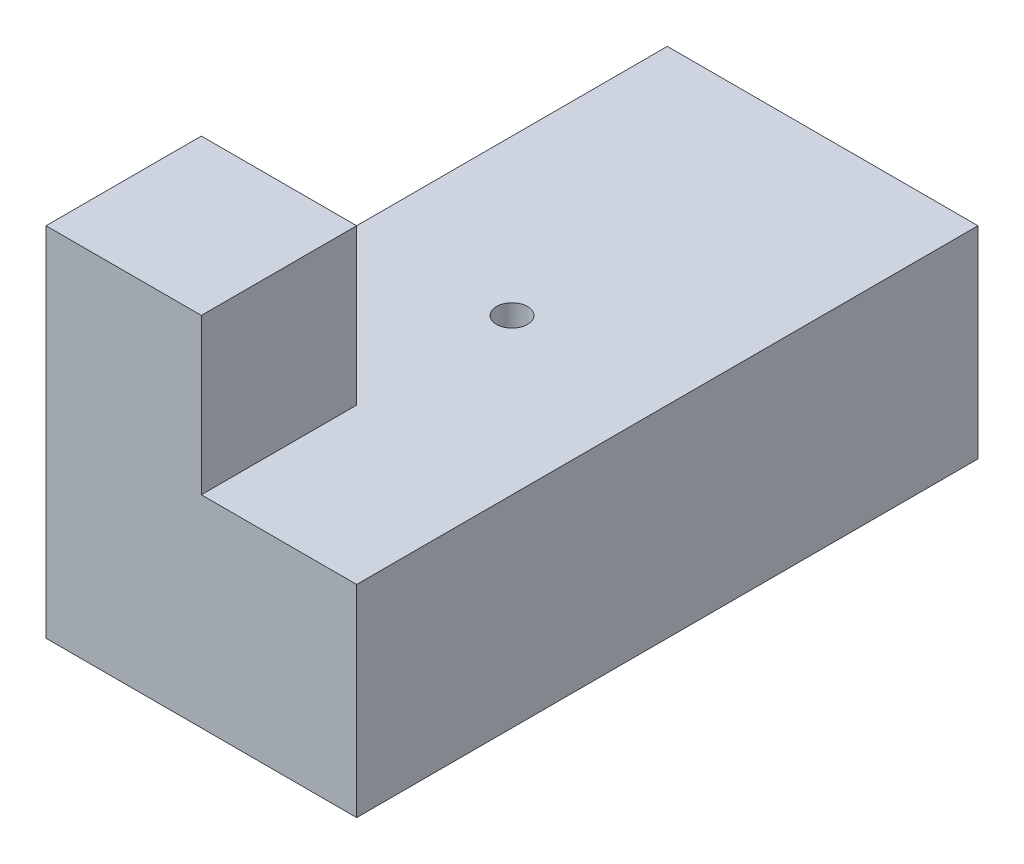
ISO-10303-21;
HEADER;
FILE_DESCRIPTION(('STEP AP214'),'2;1');
FILE_NAME('part.step','',(''),(''),'','','');
FILE_SCHEMA(('AUTOMOTIVE_DESIGN { 1 0 10303 214 1 1 1 1 }'));
ENDSEC;
DATA;
#1=APPLICATION_CONTEXT('core data for automotive mechanical design processes');
#2=APPLICATION_PROTOCOL_DEFINITION('international standard','automotive_design',2000,#1);
#3=PRODUCT_CONTEXT('',#1,'mechanical');
#4=PRODUCT('Part','Part','',(#3));
#5=PRODUCT_RELATED_PRODUCT_CATEGORY('part','',(#4));
#6=PRODUCT_DEFINITION_FORMATION('','',#4);
#7=PRODUCT_DEFINITION_CONTEXT('part definition',#1,'design');
#8=PRODUCT_DEFINITION('design','',#6,#7);
#9=PRODUCT_DEFINITION_SHAPE('','',#8);
#10=(LENGTH_UNIT() NAMED_UNIT(*) SI_UNIT(.MILLI.,.METRE.));
#11=(NAMED_UNIT(*) PLANE_ANGLE_UNIT() SI_UNIT($,.RADIAN.));
#12=(NAMED_UNIT(*) SI_UNIT($,.STERADIAN.) SOLID_ANGLE_UNIT());
#13=UNCERTAINTY_MEASURE_WITH_UNIT(LENGTH_MEASURE(1.E-05),#10,'distance_accuracy_value','');
#14=(GEOMETRIC_REPRESENTATION_CONTEXT(3) GLOBAL_UNCERTAINTY_ASSIGNED_CONTEXT((#13)) GLOBAL_UNIT_ASSIGNED_CONTEXT((#10,
#11,#12)) REPRESENTATION_CONTEXT('',''));
#15=CARTESIAN_POINT('',(0.,0.,0.));
#16=DIRECTION('',(0.,0.,1.));
#17=DIRECTION('',(1.,0.,0.));
#18=AXIS2_PLACEMENT_3D('',#15,#16,#17);
#19=CARTESIAN_POINT('',(100.,65.,0.));
#20=DIRECTION('',(1.,0.,0.));
#21=DIRECTION('',(0.,0.,-1.));
#22=AXIS2_PLACEMENT_3D('',#19,#20,#21);
#23=PLANE('',#22);
#24=DIRECTION('',(0.,0.,1.));
#25=VECTOR('',#24,1.);
#26=CARTESIAN_POINT('',(100.,0.,0.));
#27=LINE('',#26,#25);
#28=CARTESIAN_POINT('',(100.,0.,-200.));
#29=VERTEX_POINT('',#28);
#30=CARTESIAN_POINT('',(100.,0.,0.));
#31=VERTEX_POINT('',#30);
#32=EDGE_CURVE('E140',#29,#31,#27,.T.);
#33=ORIENTED_EDGE('',*,*,#32,.F.);
#34=DIRECTION('',(0.,-1.,0.));
#35=VECTOR('',#34,1.);
#36=CARTESIAN_POINT('',(100.,65.,-200.));
#37=LINE('',#36,#35);
#38=CARTESIAN_POINT('',(100.,65.,-200.));
#39=VERTEX_POINT('',#38);
#40=EDGE_CURVE('E11',#39,#29,#37,.T.);
#41=ORIENTED_EDGE('',*,*,#40,.F.);
#42=DIRECTION('',(0.,0.,1.));
#43=VECTOR('',#42,1.);
#44=CARTESIAN_POINT('',(100.,65.,0.));
#45=LINE('',#44,#43);
#46=CARTESIAN_POINT('',(100.,65.,0.));
#47=VERTEX_POINT('',#46);
#48=EDGE_CURVE('E141',#39,#47,#45,.T.);
#49=ORIENTED_EDGE('',*,*,#48,.T.);
#50=DIRECTION('',(0.,-1.,0.));
#51=VECTOR('',#50,1.);
#52=CARTESIAN_POINT('',(100.,65.,0.));
#53=LINE('',#52,#51);
#54=EDGE_CURVE('E106',#47,#31,#53,.T.);
#55=ORIENTED_EDGE('',*,*,#54,.T.);
#56=EDGE_LOOP('',(#33,#41,#49,#55));
#57=FACE_BOUND('',#56,.T.);
#58=ADVANCED_FACE('F35',(#57),#23,.T.);
#59=CARTESIAN_POINT('',(0.,65.,-200.));
#60=DIRECTION('',(0.,0.,-1.));
#61=DIRECTION('',(-1.,0.,0.));
#62=AXIS2_PLACEMENT_3D('',#59,#60,#61);
#63=PLANE('',#62);
#64=DIRECTION('',(1.,0.,0.));
#65=VECTOR('',#64,1.);
#66=CARTESIAN_POINT('',(0.,0.,-200.));
#67=LINE('',#66,#65);
#68=CARTESIAN_POINT('',(0.,0.,-200.));
#69=VERTEX_POINT('',#68);
#70=EDGE_CURVE('E153',#69,#29,#67,.T.);
#71=ORIENTED_EDGE('',*,*,#70,.F.);
#72=DIRECTION('',(0.,-1.,0.));
#73=VECTOR('',#72,1.);
#74=CARTESIAN_POINT('',(0.,65.,-200.));
#75=LINE('',#74,#73);
#76=CARTESIAN_POINT('',(0.,65.,-200.));
#77=VERTEX_POINT('',#76);
#78=EDGE_CURVE('E42',#77,#69,#75,.T.);
#79=ORIENTED_EDGE('',*,*,#78,.F.);
#80=DIRECTION('',(1.,0.,0.));
#81=VECTOR('',#80,1.);
#82=CARTESIAN_POINT('',(0.,65.,-200.));
#83=LINE('',#82,#81);
#84=EDGE_CURVE('E144',#77,#39,#83,.T.);
#85=ORIENTED_EDGE('',*,*,#84,.T.);
#86=ORIENTED_EDGE('',*,*,#40,.T.);
#87=EDGE_LOOP('',(#71,#79,#85,#86));
#88=FACE_BOUND('',#87,.T.);
#89=ADVANCED_FACE('F162',(#88),#63,.T.);
#90=CARTESIAN_POINT('',(0.,65.,0.));
#91=DIRECTION('',(1.,0.,0.));
#92=DIRECTION('',(0.,0.,-1.));
#93=AXIS2_PLACEMENT_3D('',#90,#91,#92);
#94=PLANE('',#93);
#95=DIRECTION('',(0.,0.,1.));
#96=VECTOR('',#95,1.);
#97=CARTESIAN_POINT('',(0.,0.,0.));
#98=LINE('',#97,#96);
#99=CARTESIAN_POINT('',(0.,0.,0.));
#100=VERTEX_POINT('',#99);
#101=EDGE_CURVE('E102',#69,#100,#98,.T.);
#102=ORIENTED_EDGE('',*,*,#101,.T.);
#103=DIRECTION('',(0.,-1.,0.));
#104=VECTOR('',#103,1.);
#105=CARTESIAN_POINT('',(0.,65.,0.));
#106=LINE('',#105,#104);
#107=CARTESIAN_POINT('',(0.,115.,0.));
#108=VERTEX_POINT('',#107);
#109=EDGE_CURVE('E95',#108,#100,#106,.T.);
#110=ORIENTED_EDGE('',*,*,#109,.F.);
#111=DIRECTION('',(0.,0.,1.));
#112=VECTOR('',#111,1.);
#113=CARTESIAN_POINT('',(0.,115.,0.));
#114=LINE('',#113,#112);
#115=CARTESIAN_POINT('',(0.,115.,-50.));
#116=VERTEX_POINT('',#115);
#117=EDGE_CURVE('E100',#116,#108,#114,.T.);
#118=ORIENTED_EDGE('',*,*,#117,.F.);
#119=DIRECTION('',(0.,-1.,0.));
#120=VECTOR('',#119,1.);
#121=CARTESIAN_POINT('',(0.,115.,-50.));
#122=LINE('',#121,#120);
#123=CARTESIAN_POINT('',(0.,65.,-50.));
#124=VERTEX_POINT('',#123);
#125=EDGE_CURVE('E127',#116,#124,#122,.T.);
#126=ORIENTED_EDGE('',*,*,#125,.T.);
#127=DIRECTION('',(0.,0.,1.));
#128=VECTOR('',#127,1.);
#129=CARTESIAN_POINT('',(0.,65.,0.));
#130=LINE('',#129,#128);
#131=EDGE_CURVE('E55',#77,#124,#130,.T.);
#132=ORIENTED_EDGE('',*,*,#131,.F.);
#133=ORIENTED_EDGE('',*,*,#78,.T.);
#134=EDGE_LOOP('',(#102,#110,#118,#126,#132,#133));
#135=FACE_BOUND('',#134,.T.);
#136=ADVANCED_FACE('F97',(#135),#94,.F.);
#137=CARTESIAN_POINT('',(0.,65.,0.));
#138=DIRECTION('',(0.,0.,-1.));
#139=DIRECTION('',(-1.,0.,0.));
#140=AXIS2_PLACEMENT_3D('',#137,#138,#139);
#141=PLANE('',#140);
#142=DIRECTION('',(1.,0.,0.));
#143=VECTOR('',#142,1.);
#144=CARTESIAN_POINT('',(0.,0.,0.));
#145=LINE('',#144,#143);
#146=EDGE_CURVE('E145',#100,#31,#145,.T.);
#147=ORIENTED_EDGE('',*,*,#146,.T.);
#148=ORIENTED_EDGE('',*,*,#54,.F.);
#149=DIRECTION('',(1.,0.,0.));
#150=VECTOR('',#149,1.);
#151=CARTESIAN_POINT('',(0.,65.,0.));
#152=LINE('',#151,#150);
#153=CARTESIAN_POINT('',(50.,65.,0.));
#154=VERTEX_POINT('',#153);
#155=EDGE_CURVE('E149',#154,#47,#152,.T.);
#156=ORIENTED_EDGE('',*,*,#155,.F.);
#157=DIRECTION('',(0.,-1.,0.));
#158=VECTOR('',#157,1.);
#159=CARTESIAN_POINT('',(50.,115.,0.));
#160=LINE('',#159,#158);
#161=CARTESIAN_POINT('',(50.,115.,0.));
#162=VERTEX_POINT('',#161);
#163=EDGE_CURVE('E112',#162,#154,#160,.T.);
#164=ORIENTED_EDGE('',*,*,#163,.F.);
#165=DIRECTION('',(1.,0.,0.));
#166=VECTOR('',#165,1.);
#167=CARTESIAN_POINT('',(0.,115.,0.));
#168=LINE('',#167,#166);
#169=EDGE_CURVE('E109',#108,#162,#168,.T.);
#170=ORIENTED_EDGE('',*,*,#169,.F.);
#171=ORIENTED_EDGE('',*,*,#109,.T.);
#172=EDGE_LOOP('',(#147,#148,#156,#164,#170,#171));
#173=FACE_BOUND('',#172,.T.);
#174=ADVANCED_FACE('F110',(#173),#141,.F.);
#175=CARTESIAN_POINT('',(0.,65.,0.));
#176=DIRECTION('',(0.,1.,0.));
#177=DIRECTION('',(0.,0.,1.));
#178=AXIS2_PLACEMENT_3D('',#175,#176,#177);
#179=PLANE('',#178);
#180=DIRECTION('',(-1.,0.,0.));
#181=VECTOR('',#180,1.);
#182=CARTESIAN_POINT('',(0.,65.,-50.));
#183=LINE('',#182,#181);
#184=CARTESIAN_POINT('',(50.,65.,-50.));
#185=VERTEX_POINT('',#184);
#186=EDGE_CURVE('E121',#185,#124,#183,.T.);
#187=ORIENTED_EDGE('',*,*,#186,.F.);
#188=DIRECTION('',(0.,0.,-1.));
#189=VECTOR('',#188,1.);
#190=CARTESIAN_POINT('',(50.,65.,0.));
#191=LINE('',#190,#189);
#192=EDGE_CURVE('E49',#154,#185,#191,.T.);
#193=ORIENTED_EDGE('',*,*,#192,.F.);
#194=ORIENTED_EDGE('',*,*,#155,.T.);
#195=ORIENTED_EDGE('',*,*,#48,.F.);
#196=ORIENTED_EDGE('',*,*,#84,.F.);
#197=ORIENTED_EDGE('',*,*,#131,.T.);
#198=EDGE_LOOP('',(#187,#193,#194,#195,#196,#197));
#199=FACE_BOUND('',#198,.T.);
#200=CARTESIAN_POINT('',(50.,65.,-100.));
#201=DIRECTION('',(0.,1.,0.));
#202=DIRECTION('',(0.,0.,1.));
#203=AXIS2_PLACEMENT_3D('',#200,#201,#202);
#204=CIRCLE('',#203,5.);
#205=CARTESIAN_POINT('',(50.,65.,-95.));
#206=VERTEX_POINT('',#205);
#207=EDGE_CURVE('E134',#206,#206,#204,.T.);
#208=ORIENTED_EDGE('',*,*,#207,.F.);
#209=EDGE_LOOP('',(#208));
#210=FACE_BOUND('',#209,.T.);
#211=ADVANCED_FACE('F172',(#199,#210),#179,.T.);
#212=CARTESIAN_POINT('',(0.,0.,0.));
#213=DIRECTION('',(0.,1.,0.));
#214=DIRECTION('',(0.,0.,1.));
#215=AXIS2_PLACEMENT_3D('',#212,#213,#214);
#216=PLANE('',#215);
#217=ORIENTED_EDGE('',*,*,#32,.T.);
#218=ORIENTED_EDGE('',*,*,#146,.F.);
#219=ORIENTED_EDGE('',*,*,#101,.F.);
#220=ORIENTED_EDGE('',*,*,#70,.T.);
#221=EDGE_LOOP('',(#217,#218,#219,#220));
#222=FACE_BOUND('',#221,.T.);
#223=ADVANCED_FACE('F161',(#222),#216,.F.);
#224=CARTESIAN_POINT('',(50.,25.,-100.));
#225=DIRECTION('',(0.,1.,0.));
#226=DIRECTION('',(0.,0.,1.));
#227=AXIS2_PLACEMENT_3D('',#224,#225,#226);
#228=CONICAL_SURFACE('',#227,4.99999999999999,1.02974425867665);
#229=CARTESIAN_POINT('',(50.,21.9956969048622,-100.));
#230=VERTEX_POINT('',#229);
#231=VERTEX_LOOP('',#230);
#232=FACE_BOUND('',#231,.T.);
#233=CARTESIAN_POINT('',(50.,25.,-100.));
#234=DIRECTION('',(0.,1.,0.));
#235=DIRECTION('',(0.,0.,1.));
#236=AXIS2_PLACEMENT_3D('',#233,#234,#235);
#237=CIRCLE('',#236,4.99999999999999);
#238=CARTESIAN_POINT('',(50.,25.,-95.));
#239=VERTEX_POINT('',#238);
#240=EDGE_CURVE('E137',#239,#239,#237,.T.);
#241=ORIENTED_EDGE('',*,*,#240,.T.);
#242=EDGE_LOOP('',(#241));
#243=FACE_BOUND('',#242,.T.);
#244=ADVANCED_FACE('F180',(#232,#243),#228,.F.);
#245=CARTESIAN_POINT('',(50.,65.,-100.));
#246=DIRECTION('',(0.,1.,0.));
#247=DIRECTION('',(0.,0.,1.));
#248=AXIS2_PLACEMENT_3D('',#245,#246,#247);
#249=CYLINDRICAL_SURFACE('',#248,4.99999999999999);
#250=ORIENTED_EDGE('',*,*,#240,.F.);
#251=EDGE_LOOP('',(#250));
#252=FACE_BOUND('',#251,.T.);
#253=ORIENTED_EDGE('',*,*,#207,.T.);
#254=EDGE_LOOP('',(#253));
#255=FACE_BOUND('',#254,.T.);
#256=ADVANCED_FACE('F178',(#252,#255),#249,.F.);
#257=CARTESIAN_POINT('',(50.,115.,0.));
#258=DIRECTION('',(-1.,0.,0.));
#259=DIRECTION('',(0.,0.,1.));
#260=AXIS2_PLACEMENT_3D('',#257,#258,#259);
#261=PLANE('',#260);
#262=ORIENTED_EDGE('',*,*,#192,.T.);
#263=DIRECTION('',(0.,-1.,0.));
#264=VECTOR('',#263,1.);
#265=CARTESIAN_POINT('',(50.,115.,-50.));
#266=LINE('',#265,#264);
#267=CARTESIAN_POINT('',(50.,115.,-50.));
#268=VERTEX_POINT('',#267);
#269=EDGE_CURVE('E130',#268,#185,#266,.T.);
#270=ORIENTED_EDGE('',*,*,#269,.F.);
#271=DIRECTION('',(0.,0.,-1.));
#272=VECTOR('',#271,1.);
#273=CARTESIAN_POINT('',(50.,115.,0.));
#274=LINE('',#273,#272);
#275=EDGE_CURVE('E115',#162,#268,#274,.T.);
#276=ORIENTED_EDGE('',*,*,#275,.F.);
#277=ORIENTED_EDGE('',*,*,#163,.T.);
#278=EDGE_LOOP('',(#262,#270,#276,#277));
#279=FACE_BOUND('',#278,.T.);
#280=ADVANCED_FACE('F168',(#279),#261,.F.);
#281=CARTESIAN_POINT('',(0.,115.,-50.));
#282=DIRECTION('',(0.,0.,1.));
#283=DIRECTION('',(1.,0.,0.));
#284=AXIS2_PLACEMENT_3D('',#281,#282,#283);
#285=PLANE('',#284);
#286=ORIENTED_EDGE('',*,*,#186,.T.);
#287=ORIENTED_EDGE('',*,*,#125,.F.);
#288=DIRECTION('',(-1.,0.,0.));
#289=VECTOR('',#288,1.);
#290=CARTESIAN_POINT('',(0.,115.,-50.));
#291=LINE('',#290,#289);
#292=EDGE_CURVE('E119',#268,#116,#291,.T.);
#293=ORIENTED_EDGE('',*,*,#292,.F.);
#294=ORIENTED_EDGE('',*,*,#269,.T.);
#295=EDGE_LOOP('',(#286,#287,#293,#294));
#296=FACE_BOUND('',#295,.T.);
#297=ADVANCED_FACE('F171',(#296),#285,.F.);
#298=CARTESIAN_POINT('',(0.,115.,0.));
#299=DIRECTION('',(0.,-1.,0.));
#300=DIRECTION('',(0.,0.,-1.));
#301=AXIS2_PLACEMENT_3D('',#298,#299,#300);
#302=PLANE('',#301);
#303=ORIENTED_EDGE('',*,*,#117,.T.);
#304=ORIENTED_EDGE('',*,*,#169,.T.);
#305=ORIENTED_EDGE('',*,*,#275,.T.);
#306=ORIENTED_EDGE('',*,*,#292,.T.);
#307=EDGE_LOOP('',(#303,#304,#305,#306));
#308=FACE_BOUND('',#307,.T.);
#309=ADVANCED_FACE('F117',(#308),#302,.F.);
#310=CLOSED_SHELL('',(#58,#89,#136,#174,#211,#223,#244,#256,#280,#297,#309));
#311=MANIFOLD_SOLID_BREP('B2',#310);
#312=ADVANCED_BREP_SHAPE_REPRESENTATION('',(#18,#311),#14);
#313=SHAPE_DEFINITION_REPRESENTATION(#9,#312);
ENDSEC;
END-ISO-10303-21;
